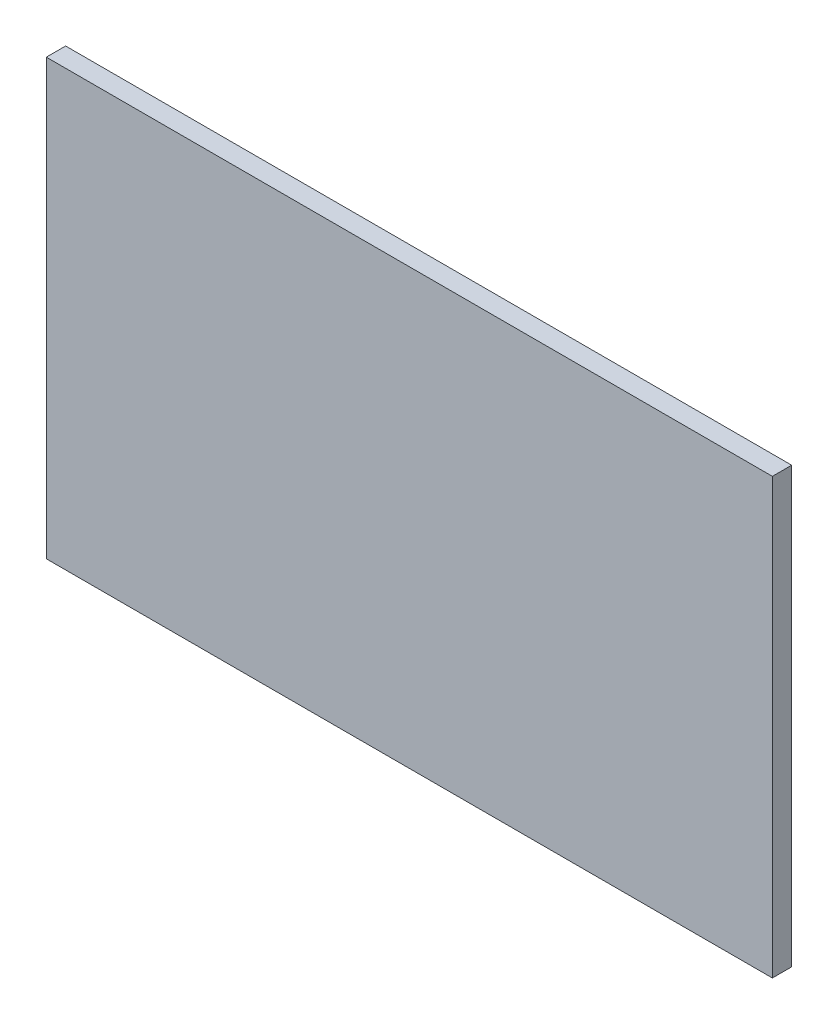
ISO-10303-21;
HEADER;
FILE_DESCRIPTION(('STEP AP214'),'2;1');
FILE_NAME('part.step','',(''),(''),'','','');
FILE_SCHEMA(('AUTOMOTIVE_DESIGN { 1 0 10303 214 1 1 1 1 }'));
ENDSEC;
DATA;
#1=APPLICATION_CONTEXT('core data for automotive mechanical design processes');
#2=APPLICATION_PROTOCOL_DEFINITION('international standard','automotive_design',2000,#1);
#3=PRODUCT_CONTEXT('',#1,'mechanical');
#4=PRODUCT('Part','Part','',(#3));
#5=PRODUCT_RELATED_PRODUCT_CATEGORY('part','',(#4));
#6=PRODUCT_DEFINITION_FORMATION('','',#4);
#7=PRODUCT_DEFINITION_CONTEXT('part definition',#1,'design');
#8=PRODUCT_DEFINITION('design','',#6,#7);
#9=PRODUCT_DEFINITION_SHAPE('','',#8);
#10=(LENGTH_UNIT() NAMED_UNIT(*) SI_UNIT(.MILLI.,.METRE.));
#11=(NAMED_UNIT(*) PLANE_ANGLE_UNIT() SI_UNIT($,.RADIAN.));
#12=(NAMED_UNIT(*) SI_UNIT($,.STERADIAN.) SOLID_ANGLE_UNIT());
#13=UNCERTAINTY_MEASURE_WITH_UNIT(LENGTH_MEASURE(1.E-05),#10,'distance_accuracy_value','');
#14=(GEOMETRIC_REPRESENTATION_CONTEXT(3) GLOBAL_UNCERTAINTY_ASSIGNED_CONTEXT((#13)) GLOBAL_UNIT_ASSIGNED_CONTEXT((#10,
#11,#12)) REPRESENTATION_CONTEXT('',''));
#15=CARTESIAN_POINT('',(0.,0.,0.));
#16=DIRECTION('',(0.,0.,1.));
#17=DIRECTION('',(1.,0.,0.));
#18=AXIS2_PLACEMENT_3D('',#15,#16,#17);
#19=CARTESIAN_POINT('',(-188.,39.5194310660908,-10.));
#20=DIRECTION('',(-1.,0.,0.));
#21=DIRECTION('',(0.,-1.,0.));
#22=AXIS2_PLACEMENT_3D('',#19,#20,#21);
#23=PLANE('',#22);
#24=DIRECTION('',(0.,-1.,0.));
#25=VECTOR('',#24,1.);
#26=CARTESIAN_POINT('',(-188.,39.5194310660908,0.));
#27=LINE('',#26,#25);
#28=CARTESIAN_POINT('',(-188.,39.5194310660908,0.));
#29=VERTEX_POINT('',#28);
#30=CARTESIAN_POINT('',(-188.,-185.480568933909,0.));
#31=VERTEX_POINT('',#30);
#32=EDGE_CURVE('E99',#29,#31,#27,.T.);
#33=ORIENTED_EDGE('',*,*,#32,.F.);
#34=DIRECTION('',(0.,0.,1.));
#35=VECTOR('',#34,1.);
#36=CARTESIAN_POINT('',(-188.,39.5194310660908,-10.));
#37=LINE('',#36,#35);
#38=CARTESIAN_POINT('',(-188.,39.5194310660908,-10.));
#39=VERTEX_POINT('',#38);
#40=EDGE_CURVE('E11',#39,#29,#37,.T.);
#41=ORIENTED_EDGE('',*,*,#40,.F.);
#42=DIRECTION('',(0.,-1.,0.));
#43=VECTOR('',#42,1.);
#44=CARTESIAN_POINT('',(-188.,39.5194310660908,-10.));
#45=LINE('',#44,#43);
#46=CARTESIAN_POINT('',(-188.,-185.480568933909,-10.));
#47=VERTEX_POINT('',#46);
#48=EDGE_CURVE('E93',#39,#47,#45,.T.);
#49=ORIENTED_EDGE('',*,*,#48,.T.);
#50=DIRECTION('',(0.,0.,1.));
#51=VECTOR('',#50,1.);
#52=CARTESIAN_POINT('',(-188.,-185.480568933909,-10.));
#53=LINE('',#52,#51);
#54=EDGE_CURVE('E38',#47,#31,#53,.T.);
#55=ORIENTED_EDGE('',*,*,#54,.T.);
#56=EDGE_LOOP('',(#33,#41,#49,#55));
#57=FACE_BOUND('',#56,.T.);
#58=ADVANCED_FACE('F35',(#57),#23,.T.);
#59=CARTESIAN_POINT('',(-188.,39.5194310660908,-10.));
#60=DIRECTION('',(0.,1.,0.));
#61=DIRECTION('',(0.,0.,1.));
#62=AXIS2_PLACEMENT_3D('',#59,#60,#61);
#63=PLANE('',#62);
#64=DIRECTION('',(-1.,0.,0.));
#65=VECTOR('',#64,1.);
#66=CARTESIAN_POINT('',(-188.,39.5194310660908,0.));
#67=LINE('',#66,#65);
#68=CARTESIAN_POINT('',(188.,39.5194310660908,0.));
#69=VERTEX_POINT('',#68);
#70=EDGE_CURVE('E95',#69,#29,#67,.T.);
#71=ORIENTED_EDGE('',*,*,#70,.F.);
#72=DIRECTION('',(0.,0.,1.));
#73=VECTOR('',#72,1.);
#74=CARTESIAN_POINT('',(188.,39.5194310660908,-10.));
#75=LINE('',#74,#73);
#76=CARTESIAN_POINT('',(188.,39.5194310660908,-10.));
#77=VERTEX_POINT('',#76);
#78=EDGE_CURVE('E44',#77,#69,#75,.T.);
#79=ORIENTED_EDGE('',*,*,#78,.F.);
#80=DIRECTION('',(-1.,0.,0.));
#81=VECTOR('',#80,1.);
#82=CARTESIAN_POINT('',(-188.,39.5194310660908,-10.));
#83=LINE('',#82,#81);
#84=EDGE_CURVE('E90',#77,#39,#83,.T.);
#85=ORIENTED_EDGE('',*,*,#84,.T.);
#86=ORIENTED_EDGE('',*,*,#40,.T.);
#87=EDGE_LOOP('',(#71,#79,#85,#86));
#88=FACE_BOUND('',#87,.T.);
#89=ADVANCED_FACE('F109',(#88),#63,.T.);
#90=CARTESIAN_POINT('',(188.,39.5194310660908,-10.));
#91=DIRECTION('',(1.,0.,0.));
#92=DIRECTION('',(0.,1.,0.));
#93=AXIS2_PLACEMENT_3D('',#90,#91,#92);
#94=PLANE('',#93);
#95=DIRECTION('',(0.,1.,0.));
#96=VECTOR('',#95,1.);
#97=CARTESIAN_POINT('',(188.,39.5194310660908,0.));
#98=LINE('',#97,#96);
#99=CARTESIAN_POINT('',(188.,-185.480568933909,0.));
#100=VERTEX_POINT('',#99);
#101=EDGE_CURVE('E85',#100,#69,#98,.T.);
#102=ORIENTED_EDGE('',*,*,#101,.F.);
#103=DIRECTION('',(0.,0.,1.));
#104=VECTOR('',#103,1.);
#105=CARTESIAN_POINT('',(188.,-185.480568933909,-10.));
#106=LINE('',#105,#104);
#107=CARTESIAN_POINT('',(188.,-185.480568933909,-10.));
#108=VERTEX_POINT('',#107);
#109=EDGE_CURVE('E80',#108,#100,#106,.T.);
#110=ORIENTED_EDGE('',*,*,#109,.F.);
#111=DIRECTION('',(0.,1.,0.));
#112=VECTOR('',#111,1.);
#113=CARTESIAN_POINT('',(188.,39.5194310660908,-10.));
#114=LINE('',#113,#112);
#115=EDGE_CURVE('E83',#108,#77,#114,.T.);
#116=ORIENTED_EDGE('',*,*,#115,.T.);
#117=ORIENTED_EDGE('',*,*,#78,.T.);
#118=EDGE_LOOP('',(#102,#110,#116,#117));
#119=FACE_BOUND('',#118,.T.);
#120=ADVANCED_FACE('F82',(#119),#94,.T.);
#121=CARTESIAN_POINT('',(-188.,-185.480568933909,-10.));
#122=DIRECTION('',(0.,-1.,0.));
#123=DIRECTION('',(0.,0.,-1.));
#124=AXIS2_PLACEMENT_3D('',#121,#122,#123);
#125=PLANE('',#124);
#126=DIRECTION('',(1.,0.,0.));
#127=VECTOR('',#126,1.);
#128=CARTESIAN_POINT('',(-188.,-185.480568933909,0.));
#129=LINE('',#128,#127);
#130=EDGE_CURVE('E102',#31,#100,#129,.T.);
#131=ORIENTED_EDGE('',*,*,#130,.F.);
#132=ORIENTED_EDGE('',*,*,#54,.F.);
#133=DIRECTION('',(1.,0.,0.));
#134=VECTOR('',#133,1.);
#135=CARTESIAN_POINT('',(-188.,-185.480568933909,-10.));
#136=LINE('',#135,#134);
#137=EDGE_CURVE('E89',#47,#108,#136,.T.);
#138=ORIENTED_EDGE('',*,*,#137,.T.);
#139=ORIENTED_EDGE('',*,*,#109,.T.);
#140=EDGE_LOOP('',(#131,#132,#138,#139));
#141=FACE_BOUND('',#140,.T.);
#142=ADVANCED_FACE('F92',(#141),#125,.T.);
#143=CARTESIAN_POINT('',(0.,0.,-10.));
#144=DIRECTION('',(0.,0.,1.));
#145=DIRECTION('',(1.,0.,0.));
#146=AXIS2_PLACEMENT_3D('',#143,#144,#145);
#147=PLANE('',#146);
#148=ORIENTED_EDGE('',*,*,#48,.F.);
#149=ORIENTED_EDGE('',*,*,#84,.F.);
#150=ORIENTED_EDGE('',*,*,#115,.F.);
#151=ORIENTED_EDGE('',*,*,#137,.F.);
#152=EDGE_LOOP('',(#148,#149,#150,#151));
#153=FACE_BOUND('',#152,.T.);
#154=ADVANCED_FACE('F88',(#153),#147,.F.);
#155=CARTESIAN_POINT('',(0.,0.,0.));
#156=DIRECTION('',(0.,0.,1.));
#157=DIRECTION('',(1.,0.,0.));
#158=AXIS2_PLACEMENT_3D('',#155,#156,#157);
#159=PLANE('',#158);
#160=ORIENTED_EDGE('',*,*,#32,.T.);
#161=ORIENTED_EDGE('',*,*,#130,.T.);
#162=ORIENTED_EDGE('',*,*,#101,.T.);
#163=ORIENTED_EDGE('',*,*,#70,.T.);
#164=EDGE_LOOP('',(#160,#161,#162,#163));
#165=FACE_BOUND('',#164,.T.);
#166=ADVANCED_FACE('F108',(#165),#159,.T.);
#167=CLOSED_SHELL('',(#58,#89,#120,#142,#154,#166));
#168=MANIFOLD_SOLID_BREP('B2',#167);
#169=ADVANCED_BREP_SHAPE_REPRESENTATION('',(#18,#168),#14);
#170=SHAPE_DEFINITION_REPRESENTATION(#9,#169);
ENDSEC;
END-ISO-10303-21;
